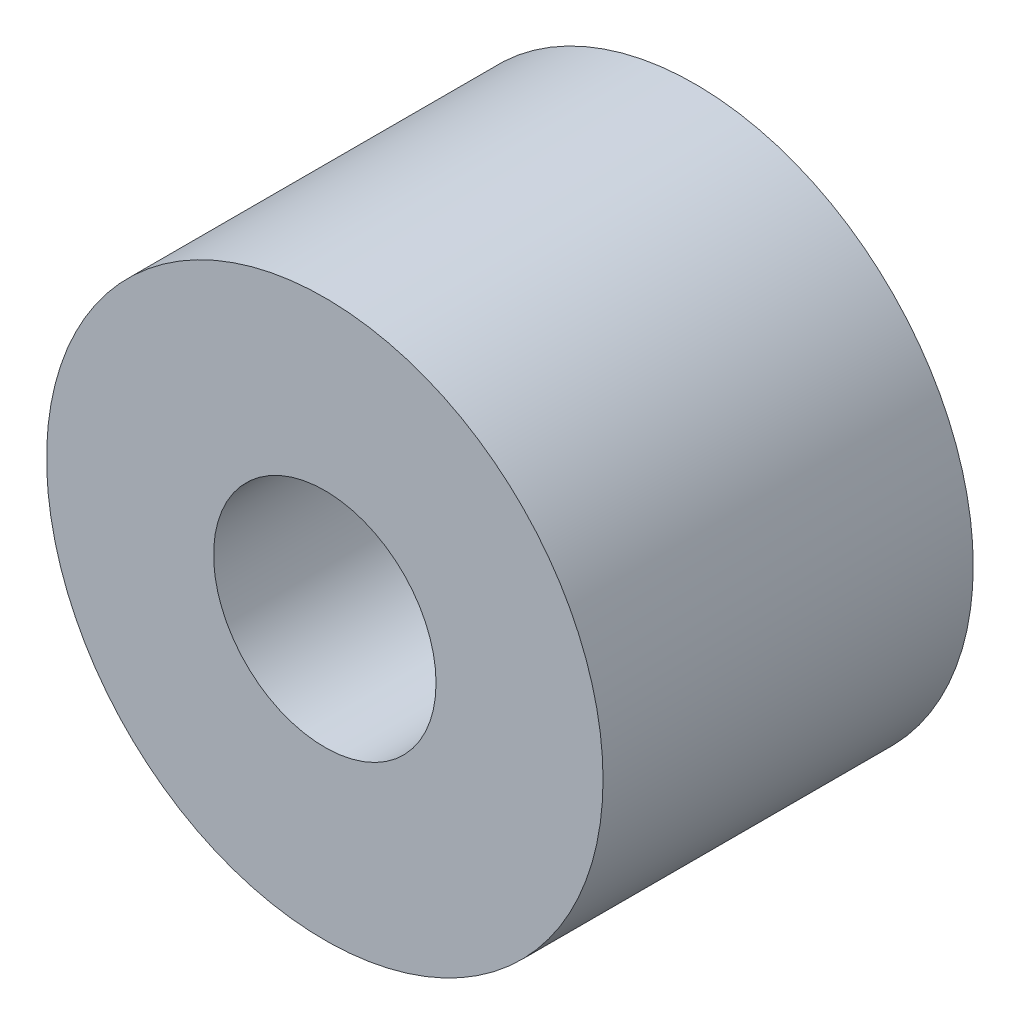
ISO-10303-21;
HEADER;
FILE_DESCRIPTION(('STEP AP214'),'2;1');
FILE_NAME('part.step','',(''),(''),'','','');
FILE_SCHEMA(('AUTOMOTIVE_DESIGN { 1 0 10303 214 1 1 1 1 }'));
ENDSEC;
DATA;
#1=APPLICATION_CONTEXT('core data for automotive mechanical design processes');
#2=APPLICATION_PROTOCOL_DEFINITION('international standard','automotive_design',2000,#1);
#3=PRODUCT_CONTEXT('',#1,'mechanical');
#4=PRODUCT('Part','Part','',(#3));
#5=PRODUCT_RELATED_PRODUCT_CATEGORY('part','',(#4));
#6=PRODUCT_DEFINITION_FORMATION('','',#4);
#7=PRODUCT_DEFINITION_CONTEXT('part definition',#1,'design');
#8=PRODUCT_DEFINITION('design','',#6,#7);
#9=PRODUCT_DEFINITION_SHAPE('','',#8);
#10=(LENGTH_UNIT() NAMED_UNIT(*) SI_UNIT(.MILLI.,.METRE.));
#11=(NAMED_UNIT(*) PLANE_ANGLE_UNIT() SI_UNIT($,.RADIAN.));
#12=(NAMED_UNIT(*) SI_UNIT($,.STERADIAN.) SOLID_ANGLE_UNIT());
#13=UNCERTAINTY_MEASURE_WITH_UNIT(LENGTH_MEASURE(1.E-05),#10,'distance_accuracy_value','');
#14=(GEOMETRIC_REPRESENTATION_CONTEXT(3) GLOBAL_UNCERTAINTY_ASSIGNED_CONTEXT((#13)) GLOBAL_UNIT_ASSIGNED_CONTEXT((#10,
#11,#12)) REPRESENTATION_CONTEXT('',''));
#15=CARTESIAN_POINT('',(0.,0.,0.));
#16=DIRECTION('',(0.,0.,1.));
#17=DIRECTION('',(1.,0.,0.));
#18=AXIS2_PLACEMENT_3D('',#15,#16,#17);
#19=CARTESIAN_POINT('',(0.,0.,1268.));
#20=DIRECTION('',(0.,0.,1.));
#21=DIRECTION('',(1.,0.,0.));
#22=AXIS2_PLACEMENT_3D('',#19,#20,#21);
#23=PLANE('',#22);
#24=CARTESIAN_POINT('',(0.,0.,1268.));
#25=DIRECTION('',(0.,0.,1.));
#26=DIRECTION('',(1.,0.,0.));
#27=AXIS2_PLACEMENT_3D('',#24,#25,#26);
#28=CIRCLE('',#27,953.);
#29=CARTESIAN_POINT('',(953.,0.,1268.));
#30=VERTEX_POINT('',#29);
#31=EDGE_CURVE('E10',#30,#30,#28,.T.);
#32=ORIENTED_EDGE('',*,*,#31,.T.);
#33=EDGE_LOOP('',(#32));
#34=FACE_BOUND('',#33,.T.);
#35=CARTESIAN_POINT('',(0.,0.,1268.));
#36=DIRECTION('',(0.,0.,1.));
#37=DIRECTION('',(1.,0.,0.));
#38=AXIS2_PLACEMENT_3D('',#35,#36,#37);
#39=CIRCLE('',#38,381.);
#40=CARTESIAN_POINT('',(381.,0.,1268.));
#41=VERTEX_POINT('',#40);
#42=EDGE_CURVE('E50',#41,#41,#39,.T.);
#43=ORIENTED_EDGE('',*,*,#42,.F.);
#44=EDGE_LOOP('',(#43));
#45=FACE_BOUND('',#44,.T.);
#46=ADVANCED_FACE('F39',(#34,#45),#23,.T.);
#47=CARTESIAN_POINT('',(0.,0.,0.));
#48=DIRECTION('',(0.,0.,1.));
#49=DIRECTION('',(1.,0.,0.));
#50=AXIS2_PLACEMENT_3D('',#47,#48,#49);
#51=PLANE('',#50);
#52=CARTESIAN_POINT('',(0.,0.,0.));
#53=DIRECTION('',(0.,0.,1.));
#54=DIRECTION('',(1.,0.,0.));
#55=AXIS2_PLACEMENT_3D('',#52,#53,#54);
#56=CIRCLE('',#55,953.);
#57=CARTESIAN_POINT('',(953.,0.,0.));
#58=VERTEX_POINT('',#57);
#59=EDGE_CURVE('E43',#58,#58,#56,.T.);
#60=ORIENTED_EDGE('',*,*,#59,.F.);
#61=EDGE_LOOP('',(#60));
#62=FACE_BOUND('',#61,.T.);
#63=CARTESIAN_POINT('',(0.,0.,0.));
#64=DIRECTION('',(0.,0.,1.));
#65=DIRECTION('',(1.,0.,0.));
#66=AXIS2_PLACEMENT_3D('',#63,#64,#65);
#67=CIRCLE('',#66,381.);
#68=CARTESIAN_POINT('',(381.,0.,0.));
#69=VERTEX_POINT('',#68);
#70=EDGE_CURVE('E52',#69,#69,#67,.T.);
#71=ORIENTED_EDGE('',*,*,#70,.T.);
#72=EDGE_LOOP('',(#71));
#73=FACE_BOUND('',#72,.T.);
#74=ADVANCED_FACE('F62',(#62,#73),#51,.F.);
#75=CARTESIAN_POINT('',(0.,0.,1268.));
#76=DIRECTION('',(0.,0.,-1.));
#77=DIRECTION('',(-1.,0.,0.));
#78=AXIS2_PLACEMENT_3D('',#75,#76,#77);
#79=CYLINDRICAL_SURFACE('',#78,953.);
#80=ORIENTED_EDGE('',*,*,#31,.F.);
#81=EDGE_LOOP('',(#80));
#82=FACE_BOUND('',#81,.T.);
#83=ORIENTED_EDGE('',*,*,#59,.T.);
#84=EDGE_LOOP('',(#83));
#85=FACE_BOUND('',#84,.T.);
#86=ADVANCED_FACE('F41',(#82,#85),#79,.T.);
#87=CARTESIAN_POINT('',(0.,0.,1268.));
#88=DIRECTION('',(0.,0.,-1.));
#89=DIRECTION('',(-1.,0.,0.));
#90=AXIS2_PLACEMENT_3D('',#87,#88,#89);
#91=CYLINDRICAL_SURFACE('',#90,381.);
#92=ORIENTED_EDGE('',*,*,#42,.T.);
#93=EDGE_LOOP('',(#92));
#94=FACE_BOUND('',#93,.T.);
#95=ORIENTED_EDGE('',*,*,#70,.F.);
#96=EDGE_LOOP('',(#95));
#97=FACE_BOUND('',#96,.T.);
#98=ADVANCED_FACE('F58',(#94,#97),#91,.F.);
#99=CLOSED_SHELL('',(#46,#74,#86,#98));
#100=MANIFOLD_SOLID_BREP('B2',#99);
#101=ADVANCED_BREP_SHAPE_REPRESENTATION('',(#18,#100),#14);
#102=SHAPE_DEFINITION_REPRESENTATION(#9,#101);
ENDSEC;
END-ISO-10303-21;
